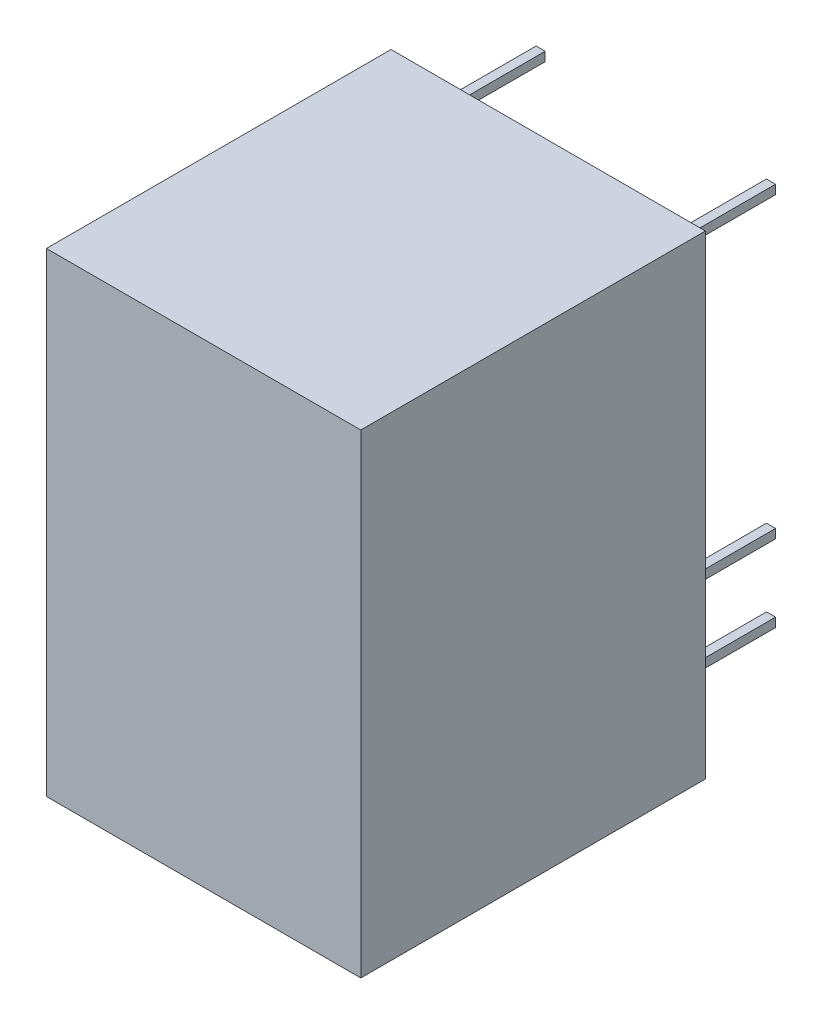
ISO-10303-21;
HEADER;
FILE_DESCRIPTION(('STEP AP214'),'2;1');
FILE_NAME('part.step','',(''),(''),'','','');
FILE_SCHEMA(('AUTOMOTIVE_DESIGN { 1 0 10303 214 1 1 1 1 }'));
ENDSEC;
DATA;
#1=APPLICATION_CONTEXT('core data for automotive mechanical design processes');
#2=APPLICATION_PROTOCOL_DEFINITION('international standard','automotive_design',2000,#1);
#3=PRODUCT_CONTEXT('',#1,'mechanical');
#4=PRODUCT('Part','Part','',(#3));
#5=PRODUCT_RELATED_PRODUCT_CATEGORY('part','',(#4));
#6=PRODUCT_DEFINITION_FORMATION('','',#4);
#7=PRODUCT_DEFINITION_CONTEXT('part definition',#1,'design');
#8=PRODUCT_DEFINITION('design','',#6,#7);
#9=PRODUCT_DEFINITION_SHAPE('','',#8);
#10=(LENGTH_UNIT() NAMED_UNIT(*) SI_UNIT(.MILLI.,.METRE.));
#11=(NAMED_UNIT(*) PLANE_ANGLE_UNIT() SI_UNIT($,.RADIAN.));
#12=(NAMED_UNIT(*) SI_UNIT($,.STERADIAN.) SOLID_ANGLE_UNIT());
#13=UNCERTAINTY_MEASURE_WITH_UNIT(LENGTH_MEASURE(1.E-05),#10,'distance_accuracy_value','');
#14=(GEOMETRIC_REPRESENTATION_CONTEXT(3) GLOBAL_UNCERTAINTY_ASSIGNED_CONTEXT((#13)) GLOBAL_UNIT_ASSIGNED_CONTEXT((#10,
#11,#12)) REPRESENTATION_CONTEXT('',''));
#15=CARTESIAN_POINT('',(0.,0.,0.));
#16=DIRECTION('',(0.,0.,1.));
#17=DIRECTION('',(1.,0.,0.));
#18=AXIS2_PLACEMENT_3D('',#15,#16,#17);
#19=CARTESIAN_POINT('',(0.15,-10.01,0.));
#20=DIRECTION('',(1.,0.,0.));
#21=DIRECTION('',(0.,1.,0.));
#22=AXIS2_PLACEMENT_3D('',#19,#20,#21);
#23=PLANE('',#22);
#24=DIRECTION('',(0.,0.,1.));
#25=VECTOR('',#24,1.);
#26=CARTESIAN_POINT('',(0.15,-9.71,0.));
#27=LINE('',#26,#25);
#28=CARTESIAN_POINT('',(0.15,-9.71,0.));
#29=VERTEX_POINT('',#28);
#30=CARTESIAN_POINT('',(0.15,-9.71,-3.6));
#31=VERTEX_POINT('',#30);
#32=EDGE_CURVE('E199',#29,#31,#27,.F.);
#33=ORIENTED_EDGE('',*,*,#32,.F.);
#34=DIRECTION('',(0.,1.,0.));
#35=VECTOR('',#34,1.);
#36=CARTESIAN_POINT('',(0.15,-10.01,0.));
#37=LINE('',#36,#35);
#38=CARTESIAN_POINT('',(0.15,-10.01,0.));
#39=VERTEX_POINT('',#38);
#40=EDGE_CURVE('E20',#29,#39,#37,.F.);
#41=ORIENTED_EDGE('',*,*,#40,.T.);
#42=DIRECTION('',(0.,0.,1.));
#43=VECTOR('',#42,1.);
#44=CARTESIAN_POINT('',(0.15,-10.01,0.));
#45=LINE('',#44,#43);
#46=CARTESIAN_POINT('',(0.15,-10.01,-3.6));
#47=VERTEX_POINT('',#46);
#48=EDGE_CURVE('E270',#47,#39,#45,.T.);
#49=ORIENTED_EDGE('',*,*,#48,.F.);
#50=DIRECTION('',(0.,1.,0.));
#51=VECTOR('',#50,1.);
#52=CARTESIAN_POINT('',(0.15,-10.01,-3.6));
#53=LINE('',#52,#51);
#54=EDGE_CURVE('E219',#31,#47,#53,.F.);
#55=ORIENTED_EDGE('',*,*,#54,.F.);
#56=EDGE_LOOP('',(#33,#41,#49,#55));
#57=FACE_BOUND('',#56,.T.);
#58=ADVANCED_FACE('F17',(#57),#23,.T.);
#59=CARTESIAN_POINT('',(-0.15,0.15,0.));
#60=DIRECTION('',(-1.,0.,0.));
#61=DIRECTION('',(0.,-1.,0.));
#62=AXIS2_PLACEMENT_3D('',#59,#60,#61);
#63=PLANE('',#62);
#64=DIRECTION('',(0.,0.,1.));
#65=VECTOR('',#64,1.);
#66=CARTESIAN_POINT('',(-0.15,-0.15,0.));
#67=LINE('',#66,#65);
#68=CARTESIAN_POINT('',(-0.15,-0.15,0.));
#69=VERTEX_POINT('',#68);
#70=CARTESIAN_POINT('',(-0.15,-0.15,-3.6));
#71=VERTEX_POINT('',#70);
#72=EDGE_CURVE('E237',#69,#71,#67,.F.);
#73=ORIENTED_EDGE('',*,*,#72,.F.);
#74=DIRECTION('',(0.,-1.,0.));
#75=VECTOR('',#74,1.);
#76=CARTESIAN_POINT('',(-0.15,0.15,0.));
#77=LINE('',#76,#75);
#78=CARTESIAN_POINT('',(-0.15,0.15,0.));
#79=VERTEX_POINT('',#78);
#80=EDGE_CURVE('E212',#69,#79,#77,.F.);
#81=ORIENTED_EDGE('',*,*,#80,.T.);
#82=DIRECTION('',(0.,0.,1.));
#83=VECTOR('',#82,1.);
#84=CARTESIAN_POINT('',(-0.15,0.15,0.));
#85=LINE('',#84,#83);
#86=CARTESIAN_POINT('',(-0.15,0.15,-3.6));
#87=VERTEX_POINT('',#86);
#88=EDGE_CURVE('E236',#87,#79,#85,.T.);
#89=ORIENTED_EDGE('',*,*,#88,.F.);
#90=DIRECTION('',(0.,1.,0.));
#91=VECTOR('',#90,1.);
#92=CARTESIAN_POINT('',(-0.15,0.15,-3.6));
#93=LINE('',#92,#91);
#94=EDGE_CURVE('E261',#71,#87,#93,.T.);
#95=ORIENTED_EDGE('',*,*,#94,.F.);
#96=EDGE_LOOP('',(#73,#81,#89,#95));
#97=FACE_BOUND('',#96,.T.);
#98=ADVANCED_FACE('F234',(#97),#63,.T.);
#99=CARTESIAN_POINT('',(7.77,-10.01,0.));
#100=DIRECTION('',(0.,1.,0.));
#101=DIRECTION('',(-1.,0.,0.));
#102=AXIS2_PLACEMENT_3D('',#99,#100,#101);
#103=PLANE('',#102);
#104=DIRECTION('',(0.,0.,1.));
#105=VECTOR('',#104,1.);
#106=CARTESIAN_POINT('',(7.47,-10.01,0.));
#107=LINE('',#106,#105);
#108=CARTESIAN_POINT('',(7.47,-10.01,0.));
#109=VERTEX_POINT('',#108);
#110=CARTESIAN_POINT('',(7.47,-10.01,-3.6));
#111=VERTEX_POINT('',#110);
#112=EDGE_CURVE('E253',#109,#111,#107,.F.);
#113=ORIENTED_EDGE('',*,*,#112,.T.);
#114=DIRECTION('',(1.,0.,0.));
#115=VECTOR('',#114,1.);
#116=CARTESIAN_POINT('',(7.47,-10.01,-3.6));
#117=LINE('',#116,#115);
#118=CARTESIAN_POINT('',(7.77,-10.01,-3.6));
#119=VERTEX_POINT('',#118);
#120=EDGE_CURVE('E357',#111,#119,#117,.T.);
#121=ORIENTED_EDGE('',*,*,#120,.T.);
#122=DIRECTION('',(0.,0.,1.));
#123=VECTOR('',#122,1.);
#124=CARTESIAN_POINT('',(7.77,-10.01,0.));
#125=LINE('',#124,#123);
#126=CARTESIAN_POINT('',(7.77,-10.01,0.));
#127=VERTEX_POINT('',#126);
#128=EDGE_CURVE('E348',#119,#127,#125,.T.);
#129=ORIENTED_EDGE('',*,*,#128,.T.);
#130=DIRECTION('',(-1.,0.,0.));
#131=VECTOR('',#130,1.);
#132=CARTESIAN_POINT('',(7.77,-10.01,0.));
#133=LINE('',#132,#131);
#134=EDGE_CURVE('E229',#109,#127,#133,.F.);
#135=ORIENTED_EDGE('',*,*,#134,.F.);
#136=EDGE_LOOP('',(#113,#121,#129,#135));
#137=FACE_BOUND('',#136,.T.);
#138=ADVANCED_FACE('F744',(#137),#103,.F.);
#139=CARTESIAN_POINT('',(7.47,0.15,0.));
#140=DIRECTION('',(0.,-1.,0.));
#141=DIRECTION('',(1.,0.,0.));
#142=AXIS2_PLACEMENT_3D('',#139,#140,#141);
#143=PLANE('',#142);
#144=DIRECTION('',(0.,0.,1.));
#145=VECTOR('',#144,1.);
#146=CARTESIAN_POINT('',(7.77,0.15,0.));
#147=LINE('',#146,#145);
#148=CARTESIAN_POINT('',(7.77,0.15,0.));
#149=VERTEX_POINT('',#148);
#150=CARTESIAN_POINT('',(7.77,0.15,-3.6));
#151=VERTEX_POINT('',#150);
#152=EDGE_CURVE('E343',#149,#151,#147,.F.);
#153=ORIENTED_EDGE('',*,*,#152,.T.);
#154=DIRECTION('',(1.,0.,0.));
#155=VECTOR('',#154,1.);
#156=CARTESIAN_POINT('',(7.77,0.15,-3.6));
#157=LINE('',#156,#155);
#158=CARTESIAN_POINT('',(7.47,0.15,-3.6));
#159=VERTEX_POINT('',#158);
#160=EDGE_CURVE('E338',#151,#159,#157,.F.);
#161=ORIENTED_EDGE('',*,*,#160,.T.);
#162=DIRECTION('',(0.,0.,1.));
#163=VECTOR('',#162,1.);
#164=CARTESIAN_POINT('',(7.47,0.15,0.));
#165=LINE('',#164,#163);
#166=CARTESIAN_POINT('',(7.47,0.15,0.));
#167=VERTEX_POINT('',#166);
#168=EDGE_CURVE('E329',#159,#167,#165,.T.);
#169=ORIENTED_EDGE('',*,*,#168,.T.);
#170=DIRECTION('',(1.,0.,0.));
#171=VECTOR('',#170,1.);
#172=CARTESIAN_POINT('',(7.47,0.15,0.));
#173=LINE('',#172,#171);
#174=EDGE_CURVE('E227',#149,#167,#173,.F.);
#175=ORIENTED_EDGE('',*,*,#174,.F.);
#176=EDGE_LOOP('',(#153,#161,#169,#175));
#177=FACE_BOUND('',#176,.T.);
#178=ADVANCED_FACE('F735',(#177),#143,.F.);
#179=CARTESIAN_POINT('',(7.771869,-12.55,0.));
#180=DIRECTION('',(0.,1.,0.));
#181=DIRECTION('',(-1.,0.,0.));
#182=AXIS2_PLACEMENT_3D('',#179,#180,#181);
#183=PLANE('',#182);
#184=DIRECTION('',(0.,0.,1.));
#185=VECTOR('',#184,1.);
#186=CARTESIAN_POINT('',(7.471869,-12.55,0.));
#187=LINE('',#186,#185);
#188=CARTESIAN_POINT('',(7.471869,-12.55,0.));
#189=VERTEX_POINT('',#188);
#190=CARTESIAN_POINT('',(7.471869,-12.55,-3.6));
#191=VERTEX_POINT('',#190);
#192=EDGE_CURVE('E324',#189,#191,#187,.F.);
#193=ORIENTED_EDGE('',*,*,#192,.T.);
#194=DIRECTION('',(1.,0.,0.));
#195=VECTOR('',#194,1.);
#196=CARTESIAN_POINT('',(7.471869,-12.55,-3.6));
#197=LINE('',#196,#195);
#198=CARTESIAN_POINT('',(7.771869,-12.55,-3.6));
#199=VERTEX_POINT('',#198);
#200=EDGE_CURVE('E319',#191,#199,#197,.T.);
#201=ORIENTED_EDGE('',*,*,#200,.T.);
#202=DIRECTION('',(0.,0.,1.));
#203=VECTOR('',#202,1.);
#204=CARTESIAN_POINT('',(7.771869,-12.55,0.));
#205=LINE('',#204,#203);
#206=CARTESIAN_POINT('',(7.771869,-12.55,0.));
#207=VERTEX_POINT('',#206);
#208=EDGE_CURVE('E310',#199,#207,#205,.T.);
#209=ORIENTED_EDGE('',*,*,#208,.T.);
#210=DIRECTION('',(-1.,0.,0.));
#211=VECTOR('',#210,1.);
#212=CARTESIAN_POINT('',(7.771869,-12.55,0.));
#213=LINE('',#212,#211);
#214=EDGE_CURVE('E222',#189,#207,#213,.F.);
#215=ORIENTED_EDGE('',*,*,#214,.F.);
#216=EDGE_LOOP('',(#193,#201,#209,#215));
#217=FACE_BOUND('',#216,.T.);
#218=ADVANCED_FACE('F726',(#217),#183,.F.);
#219=CARTESIAN_POINT('',(0.151869,-12.55,0.));
#220=DIRECTION('',(1.,0.,0.));
#221=DIRECTION('',(0.,1.,0.));
#222=AXIS2_PLACEMENT_3D('',#219,#220,#221);
#223=PLANE('',#222);
#224=DIRECTION('',(0.,0.,1.));
#225=VECTOR('',#224,1.);
#226=CARTESIAN_POINT('',(0.151869,-12.25,0.));
#227=LINE('',#226,#225);
#228=CARTESIAN_POINT('',(0.151869,-12.25,0.));
#229=VERTEX_POINT('',#228);
#230=CARTESIAN_POINT('',(0.151869,-12.25,-3.6));
#231=VERTEX_POINT('',#230);
#232=EDGE_CURVE('E306',#229,#231,#227,.F.);
#233=ORIENTED_EDGE('',*,*,#232,.F.);
#234=DIRECTION('',(0.,1.,0.));
#235=VECTOR('',#234,1.);
#236=CARTESIAN_POINT('',(0.151869,-12.55,0.));
#237=LINE('',#236,#235);
#238=CARTESIAN_POINT('',(0.151869,-12.55,0.));
#239=VERTEX_POINT('',#238);
#240=EDGE_CURVE('E220',#229,#239,#237,.F.);
#241=ORIENTED_EDGE('',*,*,#240,.T.);
#242=DIRECTION('',(0.,0.,1.));
#243=VECTOR('',#242,1.);
#244=CARTESIAN_POINT('',(0.151869,-12.55,0.));
#245=LINE('',#244,#243);
#246=CARTESIAN_POINT('',(0.151869,-12.55,-3.6));
#247=VERTEX_POINT('',#246);
#248=EDGE_CURVE('E292',#247,#239,#245,.T.);
#249=ORIENTED_EDGE('',*,*,#248,.F.);
#250=DIRECTION('',(0.,1.,0.));
#251=VECTOR('',#250,1.);
#252=CARTESIAN_POINT('',(0.151869,-12.55,-3.6));
#253=LINE('',#252,#251);
#254=EDGE_CURVE('E298',#231,#247,#253,.F.);
#255=ORIENTED_EDGE('',*,*,#254,.F.);
#256=EDGE_LOOP('',(#233,#241,#249,#255));
#257=FACE_BOUND('',#256,.T.);
#258=ADVANCED_FACE('F718',(#257),#223,.T.);
#259=CARTESIAN_POINT('',(0.15,-9.71,0.));
#260=DIRECTION('',(0.,1.,0.));
#261=DIRECTION('',(-1.,0.,0.));
#262=AXIS2_PLACEMENT_3D('',#259,#260,#261);
#263=PLANE('',#262);
#264=DIRECTION('',(0.,0.,1.));
#265=VECTOR('',#264,1.);
#266=CARTESIAN_POINT('',(-0.15,-9.71,0.));
#267=LINE('',#266,#265);
#268=CARTESIAN_POINT('',(-0.15,-9.71,0.));
#269=VERTEX_POINT('',#268);
#270=CARTESIAN_POINT('',(-0.15,-9.71,-3.6));
#271=VERTEX_POINT('',#270);
#272=EDGE_CURVE('E214',#269,#271,#267,.F.);
#273=ORIENTED_EDGE('',*,*,#272,.F.);
#274=DIRECTION('',(-1.,0.,0.));
#275=VECTOR('',#274,1.);
#276=CARTESIAN_POINT('',(0.15,-9.71,0.));
#277=LINE('',#276,#275);
#278=EDGE_CURVE('E206',#269,#29,#277,.F.);
#279=ORIENTED_EDGE('',*,*,#278,.T.);
#280=ORIENTED_EDGE('',*,*,#32,.T.);
#281=DIRECTION('',(-1.,0.,0.));
#282=VECTOR('',#281,1.);
#283=CARTESIAN_POINT('',(0.15,-9.71,-3.6));
#284=LINE('',#283,#282);
#285=EDGE_CURVE('E216',#271,#31,#284,.F.);
#286=ORIENTED_EDGE('',*,*,#285,.F.);
#287=EDGE_LOOP('',(#273,#279,#280,#286));
#288=FACE_BOUND('',#287,.T.);
#289=ADVANCED_FACE('F213',(#288),#263,.T.);
#290=CARTESIAN_POINT('',(0.15,-10.01,-3.6));
#291=DIRECTION('',(0.,0.,-1.));
#292=DIRECTION('',(-1.,0.,0.));
#293=AXIS2_PLACEMENT_3D('',#290,#291,#292);
#294=PLANE('',#293);
#295=ORIENTED_EDGE('',*,*,#285,.T.);
#296=ORIENTED_EDGE('',*,*,#54,.T.);
#297=DIRECTION('',(1.,0.,0.));
#298=VECTOR('',#297,1.);
#299=CARTESIAN_POINT('',(-0.15,-10.01,-3.6));
#300=LINE('',#299,#298);
#301=CARTESIAN_POINT('',(-0.15,-10.01,-3.6));
#302=VERTEX_POINT('',#301);
#303=EDGE_CURVE('E272',#302,#47,#300,.T.);
#304=ORIENTED_EDGE('',*,*,#303,.F.);
#305=DIRECTION('',(0.,-1.,0.));
#306=VECTOR('',#305,1.);
#307=CARTESIAN_POINT('',(-0.15,-9.71,-3.6));
#308=LINE('',#307,#306);
#309=EDGE_CURVE('E279',#271,#302,#308,.T.);
#310=ORIENTED_EDGE('',*,*,#309,.F.);
#311=EDGE_LOOP('',(#295,#296,#304,#310));
#312=FACE_BOUND('',#311,.T.);
#313=ADVANCED_FACE('F277',(#312),#294,.T.);
#314=CARTESIAN_POINT('',(-0.15,-10.01,0.));
#315=DIRECTION('',(0.,-1.,0.));
#316=DIRECTION('',(1.,0.,0.));
#317=AXIS2_PLACEMENT_3D('',#314,#315,#316);
#318=PLANE('',#317);
#319=ORIENTED_EDGE('',*,*,#48,.T.);
#320=DIRECTION('',(1.,0.,0.));
#321=VECTOR('',#320,1.);
#322=CARTESIAN_POINT('',(-0.15,-10.01,0.));
#323=LINE('',#322,#321);
#324=CARTESIAN_POINT('',(-0.15,-10.01,0.));
#325=VERTEX_POINT('',#324);
#326=EDGE_CURVE('E208',#39,#325,#323,.F.);
#327=ORIENTED_EDGE('',*,*,#326,.T.);
#328=DIRECTION('',(0.,0.,1.));
#329=VECTOR('',#328,1.);
#330=CARTESIAN_POINT('',(-0.15,-10.01,0.));
#331=LINE('',#330,#329);
#332=EDGE_CURVE('E283',#302,#325,#331,.T.);
#333=ORIENTED_EDGE('',*,*,#332,.F.);
#334=ORIENTED_EDGE('',*,*,#303,.T.);
#335=EDGE_LOOP('',(#319,#327,#333,#334));
#336=FACE_BOUND('',#335,.T.);
#337=ADVANCED_FACE('F401',(#336),#318,.T.);
#338=CARTESIAN_POINT('',(-0.15,-0.15,0.));
#339=DIRECTION('',(0.,-1.,0.));
#340=DIRECTION('',(1.,0.,0.));
#341=AXIS2_PLACEMENT_3D('',#338,#339,#340);
#342=PLANE('',#341);
#343=DIRECTION('',(0.,0.,1.));
#344=VECTOR('',#343,1.);
#345=CARTESIAN_POINT('',(0.15,-0.15,0.));
#346=LINE('',#345,#344);
#347=CARTESIAN_POINT('',(0.15,-0.15,0.));
#348=VERTEX_POINT('',#347);
#349=CARTESIAN_POINT('',(0.15,-0.15,-3.6));
#350=VERTEX_POINT('',#349);
#351=EDGE_CURVE('E285',#348,#350,#346,.F.);
#352=ORIENTED_EDGE('',*,*,#351,.F.);
#353=DIRECTION('',(1.,0.,0.));
#354=VECTOR('',#353,1.);
#355=CARTESIAN_POINT('',(-0.15,-0.15,0.));
#356=LINE('',#355,#354);
#357=EDGE_CURVE('E266',#348,#69,#356,.F.);
#358=ORIENTED_EDGE('',*,*,#357,.T.);
#359=ORIENTED_EDGE('',*,*,#72,.T.);
#360=DIRECTION('',(-1.,0.,0.));
#361=VECTOR('',#360,1.);
#362=CARTESIAN_POINT('',(-0.15,-0.15,-3.6));
#363=LINE('',#362,#361);
#364=EDGE_CURVE('E263',#350,#71,#363,.T.);
#365=ORIENTED_EDGE('',*,*,#364,.F.);
#366=EDGE_LOOP('',(#352,#358,#359,#365));
#367=FACE_BOUND('',#366,.T.);
#368=ADVANCED_FACE('F390',(#367),#342,.T.);
#369=CARTESIAN_POINT('',(-0.15,0.15,-3.6));
#370=DIRECTION('',(0.,0.,-1.));
#371=DIRECTION('',(-1.,0.,0.));
#372=AXIS2_PLACEMENT_3D('',#369,#370,#371);
#373=PLANE('',#372);
#374=ORIENTED_EDGE('',*,*,#364,.T.);
#375=ORIENTED_EDGE('',*,*,#94,.T.);
#376=DIRECTION('',(-1.,0.,0.));
#377=VECTOR('',#376,1.);
#378=CARTESIAN_POINT('',(0.15,0.15,-3.6));
#379=LINE('',#378,#377);
#380=CARTESIAN_POINT('',(0.15,0.15,-3.6));
#381=VERTEX_POINT('',#380);
#382=EDGE_CURVE('E248',#381,#87,#379,.T.);
#383=ORIENTED_EDGE('',*,*,#382,.F.);
#384=DIRECTION('',(0.,1.,0.));
#385=VECTOR('',#384,1.);
#386=CARTESIAN_POINT('',(0.15,-0.15,-3.6));
#387=LINE('',#386,#385);
#388=EDGE_CURVE('E380',#350,#381,#387,.T.);
#389=ORIENTED_EDGE('',*,*,#388,.F.);
#390=EDGE_LOOP('',(#374,#375,#383,#389));
#391=FACE_BOUND('',#390,.T.);
#392=ADVANCED_FACE('F392',(#391),#373,.T.);
#393=CARTESIAN_POINT('',(0.15,0.15,0.));
#394=DIRECTION('',(0.,1.,0.));
#395=DIRECTION('',(-1.,0.,0.));
#396=AXIS2_PLACEMENT_3D('',#393,#394,#395);
#397=PLANE('',#396);
#398=ORIENTED_EDGE('',*,*,#88,.T.);
#399=DIRECTION('',(-1.,0.,0.));
#400=VECTOR('',#399,1.);
#401=CARTESIAN_POINT('',(0.15,0.15,0.));
#402=LINE('',#401,#400);
#403=CARTESIAN_POINT('',(0.15,0.15,0.));
#404=VERTEX_POINT('',#403);
#405=EDGE_CURVE('E245',#79,#404,#402,.F.);
#406=ORIENTED_EDGE('',*,*,#405,.T.);
#407=DIRECTION('',(0.,0.,1.));
#408=VECTOR('',#407,1.);
#409=CARTESIAN_POINT('',(0.15,0.15,0.));
#410=LINE('',#409,#408);
#411=EDGE_CURVE('E376',#381,#404,#410,.T.);
#412=ORIENTED_EDGE('',*,*,#411,.F.);
#413=ORIENTED_EDGE('',*,*,#382,.T.);
#414=EDGE_LOOP('',(#398,#406,#412,#413));
#415=FACE_BOUND('',#414,.T.);
#416=ADVANCED_FACE('F243',(#415),#397,.T.);
#417=CARTESIAN_POINT('',(7.47,-10.01,0.));
#418=DIRECTION('',(1.,0.,0.));
#419=DIRECTION('',(0.,1.,0.));
#420=AXIS2_PLACEMENT_3D('',#417,#418,#419);
#421=PLANE('',#420);
#422=DIRECTION('',(0.,0.,1.));
#423=VECTOR('',#422,1.);
#424=CARTESIAN_POINT('',(7.47,-9.71,0.));
#425=LINE('',#424,#423);
#426=CARTESIAN_POINT('',(7.47,-9.71,0.));
#427=VERTEX_POINT('',#426);
#428=CARTESIAN_POINT('',(7.47,-9.71,-3.6));
#429=VERTEX_POINT('',#428);
#430=EDGE_CURVE('E369',#427,#429,#425,.F.);
#431=ORIENTED_EDGE('',*,*,#430,.T.);
#432=DIRECTION('',(0.,1.,0.));
#433=VECTOR('',#432,1.);
#434=CARTESIAN_POINT('',(7.47,-10.01,-3.6));
#435=LINE('',#434,#433);
#436=EDGE_CURVE('E354',#429,#111,#435,.F.);
#437=ORIENTED_EDGE('',*,*,#436,.T.);
#438=ORIENTED_EDGE('',*,*,#112,.F.);
#439=DIRECTION('',(0.,1.,0.));
#440=VECTOR('',#439,1.);
#441=CARTESIAN_POINT('',(7.47,-10.01,0.));
#442=LINE('',#441,#440);
#443=EDGE_CURVE('E256',#427,#109,#442,.F.);
#444=ORIENTED_EDGE('',*,*,#443,.F.);
#445=EDGE_LOOP('',(#431,#437,#438,#444));
#446=FACE_BOUND('',#445,.T.);
#447=ADVANCED_FACE('F368',(#446),#421,.F.);
#448=CARTESIAN_POINT('',(7.47,-10.01,-3.6));
#449=DIRECTION('',(0.,0.,1.));
#450=DIRECTION('',(1.,0.,0.));
#451=AXIS2_PLACEMENT_3D('',#448,#449,#450);
#452=PLANE('',#451);
#453=DIRECTION('',(1.,0.,0.));
#454=VECTOR('',#453,1.);
#455=CARTESIAN_POINT('',(7.47,-9.71,-3.6));
#456=LINE('',#455,#454);
#457=CARTESIAN_POINT('',(7.77,-9.71,-3.6));
#458=VERTEX_POINT('',#457);
#459=EDGE_CURVE('E375',#429,#458,#456,.T.);
#460=ORIENTED_EDGE('',*,*,#459,.T.);
#461=DIRECTION('',(0.,-1.,0.));
#462=VECTOR('',#461,1.);
#463=CARTESIAN_POINT('',(7.77,-9.71,-3.6));
#464=LINE('',#463,#462);
#465=EDGE_CURVE('E351',#458,#119,#464,.T.);
#466=ORIENTED_EDGE('',*,*,#465,.T.);
#467=ORIENTED_EDGE('',*,*,#120,.F.);
#468=ORIENTED_EDGE('',*,*,#436,.F.);
#469=EDGE_LOOP('',(#460,#466,#467,#468));
#470=FACE_BOUND('',#469,.T.);
#471=ADVANCED_FACE('F488',(#470),#452,.F.);
#472=CARTESIAN_POINT('',(7.77,-9.71,0.));
#473=DIRECTION('',(-1.,0.,0.));
#474=DIRECTION('',(0.,-1.,0.));
#475=AXIS2_PLACEMENT_3D('',#472,#473,#474);
#476=PLANE('',#475);
#477=ORIENTED_EDGE('',*,*,#128,.F.);
#478=ORIENTED_EDGE('',*,*,#465,.F.);
#479=DIRECTION('',(0.,0.,1.));
#480=VECTOR('',#479,1.);
#481=CARTESIAN_POINT('',(7.77,-9.71,0.));
#482=LINE('',#481,#480);
#483=CARTESIAN_POINT('',(7.77,-9.71,0.));
#484=VERTEX_POINT('',#483);
#485=EDGE_CURVE('E378',#458,#484,#482,.T.);
#486=ORIENTED_EDGE('',*,*,#485,.T.);
#487=DIRECTION('',(0.,-1.,0.));
#488=VECTOR('',#487,1.);
#489=CARTESIAN_POINT('',(7.77,-9.71,0.));
#490=LINE('',#489,#488);
#491=EDGE_CURVE('E346',#127,#484,#490,.F.);
#492=ORIENTED_EDGE('',*,*,#491,.F.);
#493=EDGE_LOOP('',(#477,#478,#486,#492));
#494=FACE_BOUND('',#493,.T.);
#495=ADVANCED_FACE('F484',(#494),#476,.F.);
#496=CARTESIAN_POINT('',(7.77,0.15,0.));
#497=DIRECTION('',(-1.,0.,0.));
#498=DIRECTION('',(0.,-1.,0.));
#499=AXIS2_PLACEMENT_3D('',#496,#497,#498);
#500=PLANE('',#499);
#501=DIRECTION('',(0.,0.,1.));
#502=VECTOR('',#501,1.);
#503=CARTESIAN_POINT('',(7.77,-0.15,0.));
#504=LINE('',#503,#502);
#505=CARTESIAN_POINT('',(7.77,-0.15,0.));
#506=VERTEX_POINT('',#505);
#507=CARTESIAN_POINT('',(7.77,-0.15,-3.6));
#508=VERTEX_POINT('',#507);
#509=EDGE_CURVE('E779',#506,#508,#504,.F.);
#510=ORIENTED_EDGE('',*,*,#509,.T.);
#511=DIRECTION('',(0.,1.,0.));
#512=VECTOR('',#511,1.);
#513=CARTESIAN_POINT('',(7.77,0.15,-3.6));
#514=LINE('',#513,#512);
#515=EDGE_CURVE('E335',#508,#151,#514,.T.);
#516=ORIENTED_EDGE('',*,*,#515,.T.);
#517=ORIENTED_EDGE('',*,*,#152,.F.);
#518=DIRECTION('',(0.,-1.,0.));
#519=VECTOR('',#518,1.);
#520=CARTESIAN_POINT('',(7.77,0.15,0.));
#521=LINE('',#520,#519);
#522=EDGE_CURVE('E340',#506,#149,#521,.F.);
#523=ORIENTED_EDGE('',*,*,#522,.F.);
#524=EDGE_LOOP('',(#510,#516,#517,#523));
#525=FACE_BOUND('',#524,.T.);
#526=ADVANCED_FACE('F480',(#525),#500,.F.);
#527=CARTESIAN_POINT('',(7.77,0.15,-3.6));
#528=DIRECTION('',(0.,0.,1.));
#529=DIRECTION('',(1.,0.,0.));
#530=AXIS2_PLACEMENT_3D('',#527,#528,#529);
#531=PLANE('',#530);
#532=DIRECTION('',(-1.,0.,0.));
#533=VECTOR('',#532,1.);
#534=CARTESIAN_POINT('',(7.77,-0.15,-3.6));
#535=LINE('',#534,#533);
#536=CARTESIAN_POINT('',(7.47,-0.15,-3.6));
#537=VERTEX_POINT('',#536);
#538=EDGE_CURVE('E781',#508,#537,#535,.T.);
#539=ORIENTED_EDGE('',*,*,#538,.T.);
#540=DIRECTION('',(0.,1.,0.));
#541=VECTOR('',#540,1.);
#542=CARTESIAN_POINT('',(7.47,-0.15,-3.6));
#543=LINE('',#542,#541);
#544=EDGE_CURVE('E332',#537,#159,#543,.T.);
#545=ORIENTED_EDGE('',*,*,#544,.T.);
#546=ORIENTED_EDGE('',*,*,#160,.F.);
#547=ORIENTED_EDGE('',*,*,#515,.F.);
#548=EDGE_LOOP('',(#539,#545,#546,#547));
#549=FACE_BOUND('',#548,.T.);
#550=ADVANCED_FACE('F476',(#549),#531,.F.);
#551=CARTESIAN_POINT('',(7.47,-0.15,0.));
#552=DIRECTION('',(1.,0.,0.));
#553=DIRECTION('',(0.,1.,0.));
#554=AXIS2_PLACEMENT_3D('',#551,#552,#553);
#555=PLANE('',#554);
#556=ORIENTED_EDGE('',*,*,#168,.F.);
#557=ORIENTED_EDGE('',*,*,#544,.F.);
#558=DIRECTION('',(0.,0.,1.));
#559=VECTOR('',#558,1.);
#560=CARTESIAN_POINT('',(7.47,-0.15,0.));
#561=LINE('',#560,#559);
#562=CARTESIAN_POINT('',(7.47,-0.15,0.));
#563=VERTEX_POINT('',#562);
#564=EDGE_CURVE('E786',#537,#563,#561,.T.);
#565=ORIENTED_EDGE('',*,*,#564,.T.);
#566=DIRECTION('',(0.,1.,0.));
#567=VECTOR('',#566,1.);
#568=CARTESIAN_POINT('',(7.47,-0.15,0.));
#569=LINE('',#568,#567);
#570=EDGE_CURVE('E327',#167,#563,#569,.F.);
#571=ORIENTED_EDGE('',*,*,#570,.F.);
#572=EDGE_LOOP('',(#556,#557,#565,#571));
#573=FACE_BOUND('',#572,.T.);
#574=ADVANCED_FACE('F472',(#573),#555,.F.);
#575=CARTESIAN_POINT('',(7.471869,-12.55,0.));
#576=DIRECTION('',(1.,0.,0.));
#577=DIRECTION('',(0.,1.,0.));
#578=AXIS2_PLACEMENT_3D('',#575,#576,#577);
#579=PLANE('',#578);
#580=DIRECTION('',(0.,0.,1.));
#581=VECTOR('',#580,1.);
#582=CARTESIAN_POINT('',(7.471869,-12.25,0.));
#583=LINE('',#582,#581);
#584=CARTESIAN_POINT('',(7.471869,-12.25,0.));
#585=VERTEX_POINT('',#584);
#586=CARTESIAN_POINT('',(7.471869,-12.25,-3.6));
#587=VERTEX_POINT('',#586);
#588=EDGE_CURVE('E789',#585,#587,#583,.F.);
#589=ORIENTED_EDGE('',*,*,#588,.T.);
#590=DIRECTION('',(0.,1.,0.));
#591=VECTOR('',#590,1.);
#592=CARTESIAN_POINT('',(7.471869,-12.55,-3.6));
#593=LINE('',#592,#591);
#594=EDGE_CURVE('E316',#587,#191,#593,.F.);
#595=ORIENTED_EDGE('',*,*,#594,.T.);
#596=ORIENTED_EDGE('',*,*,#192,.F.);
#597=DIRECTION('',(0.,1.,0.));
#598=VECTOR('',#597,1.);
#599=CARTESIAN_POINT('',(7.471869,-12.55,0.));
#600=LINE('',#599,#598);
#601=EDGE_CURVE('E321',#585,#189,#600,.F.);
#602=ORIENTED_EDGE('',*,*,#601,.F.);
#603=EDGE_LOOP('',(#589,#595,#596,#602));
#604=FACE_BOUND('',#603,.T.);
#605=ADVANCED_FACE('F468',(#604),#579,.F.);
#606=CARTESIAN_POINT('',(7.471869,-12.55,-3.6));
#607=DIRECTION('',(0.,0.,1.));
#608=DIRECTION('',(1.,0.,0.));
#609=AXIS2_PLACEMENT_3D('',#606,#607,#608);
#610=PLANE('',#609);
#611=DIRECTION('',(1.,0.,0.));
#612=VECTOR('',#611,1.);
#613=CARTESIAN_POINT('',(7.471869,-12.25,-3.6));
#614=LINE('',#613,#612);
#615=CARTESIAN_POINT('',(7.771869,-12.25,-3.6));
#616=VERTEX_POINT('',#615);
#617=EDGE_CURVE('E792',#587,#616,#614,.T.);
#618=ORIENTED_EDGE('',*,*,#617,.T.);
#619=DIRECTION('',(0.,-1.,0.));
#620=VECTOR('',#619,1.);
#621=CARTESIAN_POINT('',(7.771869,-12.25,-3.6));
#622=LINE('',#621,#620);
#623=EDGE_CURVE('E313',#616,#199,#622,.T.);
#624=ORIENTED_EDGE('',*,*,#623,.T.);
#625=ORIENTED_EDGE('',*,*,#200,.F.);
#626=ORIENTED_EDGE('',*,*,#594,.F.);
#627=EDGE_LOOP('',(#618,#624,#625,#626));
#628=FACE_BOUND('',#627,.T.);
#629=ADVANCED_FACE('F464',(#628),#610,.F.);
#630=CARTESIAN_POINT('',(7.771869,-12.25,0.));
#631=DIRECTION('',(-1.,0.,0.));
#632=DIRECTION('',(0.,-1.,0.));
#633=AXIS2_PLACEMENT_3D('',#630,#631,#632);
#634=PLANE('',#633);
#635=ORIENTED_EDGE('',*,*,#208,.F.);
#636=ORIENTED_EDGE('',*,*,#623,.F.);
#637=DIRECTION('',(0.,0.,1.));
#638=VECTOR('',#637,1.);
#639=CARTESIAN_POINT('',(7.771869,-12.25,0.));
#640=LINE('',#639,#638);
#641=CARTESIAN_POINT('',(7.771869,-12.25,0.));
#642=VERTEX_POINT('',#641);
#643=EDGE_CURVE('E795',#616,#642,#640,.T.);
#644=ORIENTED_EDGE('',*,*,#643,.T.);
#645=DIRECTION('',(0.,-1.,0.));
#646=VECTOR('',#645,1.);
#647=CARTESIAN_POINT('',(7.771869,-12.25,0.));
#648=LINE('',#647,#646);
#649=EDGE_CURVE('E308',#207,#642,#648,.F.);
#650=ORIENTED_EDGE('',*,*,#649,.F.);
#651=EDGE_LOOP('',(#635,#636,#644,#650));
#652=FACE_BOUND('',#651,.T.);
#653=ADVANCED_FACE('F460',(#652),#634,.F.);
#654=CARTESIAN_POINT('',(0.151869,-12.25,0.));
#655=DIRECTION('',(0.,1.,0.));
#656=DIRECTION('',(-1.,0.,0.));
#657=AXIS2_PLACEMENT_3D('',#654,#655,#656);
#658=PLANE('',#657);
#659=DIRECTION('',(0.,0.,1.));
#660=VECTOR('',#659,1.);
#661=CARTESIAN_POINT('',(-0.148131,-12.25,0.));
#662=LINE('',#661,#660);
#663=CARTESIAN_POINT('',(-0.148131,-12.25,0.));
#664=VERTEX_POINT('',#663);
#665=CARTESIAN_POINT('',(-0.148131,-12.25,-3.6));
#666=VERTEX_POINT('',#665);
#667=EDGE_CURVE('E798',#664,#666,#662,.F.);
#668=ORIENTED_EDGE('',*,*,#667,.F.);
#669=DIRECTION('',(-1.,0.,0.));
#670=VECTOR('',#669,1.);
#671=CARTESIAN_POINT('',(0.151869,-12.25,0.));
#672=LINE('',#671,#670);
#673=EDGE_CURVE('E303',#664,#229,#672,.F.);
#674=ORIENTED_EDGE('',*,*,#673,.T.);
#675=ORIENTED_EDGE('',*,*,#232,.T.);
#676=DIRECTION('',(-1.,0.,0.));
#677=VECTOR('',#676,1.);
#678=CARTESIAN_POINT('',(0.151869,-12.25,-3.6));
#679=LINE('',#678,#677);
#680=EDGE_CURVE('E300',#666,#231,#679,.F.);
#681=ORIENTED_EDGE('',*,*,#680,.F.);
#682=EDGE_LOOP('',(#668,#674,#675,#681));
#683=FACE_BOUND('',#682,.T.);
#684=ADVANCED_FACE('F456',(#683),#658,.T.);
#685=CARTESIAN_POINT('',(0.151869,-12.55,-3.6));
#686=DIRECTION('',(0.,0.,-1.));
#687=DIRECTION('',(-1.,0.,0.));
#688=AXIS2_PLACEMENT_3D('',#685,#686,#687);
#689=PLANE('',#688);
#690=ORIENTED_EDGE('',*,*,#680,.T.);
#691=ORIENTED_EDGE('',*,*,#254,.T.);
#692=DIRECTION('',(1.,0.,0.));
#693=VECTOR('',#692,1.);
#694=CARTESIAN_POINT('',(-0.148131,-12.55,-3.6));
#695=LINE('',#694,#693);
#696=CARTESIAN_POINT('',(-0.148131,-12.55,-3.6));
#697=VERTEX_POINT('',#696);
#698=EDGE_CURVE('E295',#697,#247,#695,.T.);
#699=ORIENTED_EDGE('',*,*,#698,.F.);
#700=DIRECTION('',(0.,-1.,0.));
#701=VECTOR('',#700,1.);
#702=CARTESIAN_POINT('',(-0.148131,-12.25,-3.6));
#703=LINE('',#702,#701);
#704=EDGE_CURVE('E800',#666,#697,#703,.T.);
#705=ORIENTED_EDGE('',*,*,#704,.F.);
#706=EDGE_LOOP('',(#690,#691,#699,#705));
#707=FACE_BOUND('',#706,.T.);
#708=ADVANCED_FACE('F452',(#707),#689,.T.);
#709=CARTESIAN_POINT('',(-0.148131,-12.55,0.));
#710=DIRECTION('',(0.,-1.,0.));
#711=DIRECTION('',(1.,0.,0.));
#712=AXIS2_PLACEMENT_3D('',#709,#710,#711);
#713=PLANE('',#712);
#714=ORIENTED_EDGE('',*,*,#248,.T.);
#715=DIRECTION('',(1.,0.,0.));
#716=VECTOR('',#715,1.);
#717=CARTESIAN_POINT('',(-0.148131,-12.55,0.));
#718=LINE('',#717,#716);
#719=CARTESIAN_POINT('',(-0.148131,-12.55,0.));
#720=VERTEX_POINT('',#719);
#721=EDGE_CURVE('E287',#239,#720,#718,.F.);
#722=ORIENTED_EDGE('',*,*,#721,.T.);
#723=DIRECTION('',(0.,0.,1.));
#724=VECTOR('',#723,1.);
#725=CARTESIAN_POINT('',(-0.148131,-12.55,0.));
#726=LINE('',#725,#724);
#727=EDGE_CURVE('E802',#697,#720,#726,.T.);
#728=ORIENTED_EDGE('',*,*,#727,.F.);
#729=ORIENTED_EDGE('',*,*,#698,.T.);
#730=EDGE_LOOP('',(#714,#722,#728,#729));
#731=FACE_BOUND('',#730,.T.);
#732=ADVANCED_FACE('F448',(#731),#713,.T.);
#733=CARTESIAN_POINT('',(9.05,-14.45,0.));
#734=DIRECTION('',(-1.,0.,0.));
#735=DIRECTION('',(0.,-1.,0.));
#736=AXIS2_PLACEMENT_3D('',#733,#734,#735);
#737=PLANE('',#736);
#738=DIRECTION('',(0.,0.,1.));
#739=VECTOR('',#738,1.);
#740=CARTESIAN_POINT('',(9.05,1.25,0.));
#741=LINE('',#740,#739);
#742=CARTESIAN_POINT('',(9.05,1.25,0.));
#743=VERTEX_POINT('',#742);
#744=CARTESIAN_POINT('',(9.05,1.25,11.4));
#745=VERTEX_POINT('',#744);
#746=EDGE_CURVE('E805',#743,#745,#741,.T.);
#747=ORIENTED_EDGE('',*,*,#746,.T.);
#748=DIRECTION('',(0.,1.,0.));
#749=VECTOR('',#748,1.);
#750=CARTESIAN_POINT('',(9.05,1.25,11.4));
#751=LINE('',#750,#749);
#752=CARTESIAN_POINT('',(9.05,-14.45,11.4));
#753=VERTEX_POINT('',#752);
#754=EDGE_CURVE('E810',#745,#753,#751,.F.);
#755=ORIENTED_EDGE('',*,*,#754,.T.);
#756=DIRECTION('',(0.,0.,1.));
#757=VECTOR('',#756,1.);
#758=CARTESIAN_POINT('',(9.05,-14.45,0.));
#759=LINE('',#758,#757);
#760=CARTESIAN_POINT('',(9.05,-14.45,0.));
#761=VERTEX_POINT('',#760);
#762=EDGE_CURVE('E815',#753,#761,#759,.F.);
#763=ORIENTED_EDGE('',*,*,#762,.T.);
#764=DIRECTION('',(0.,1.,0.));
#765=VECTOR('',#764,1.);
#766=CARTESIAN_POINT('',(9.05,1.25,0.));
#767=LINE('',#766,#765);
#768=EDGE_CURVE('E821',#743,#761,#767,.F.);
#769=ORIENTED_EDGE('',*,*,#768,.F.);
#770=EDGE_LOOP('',(#747,#755,#763,#769));
#771=FACE_BOUND('',#770,.T.);
#772=ADVANCED_FACE('F445',(#771),#737,.F.);
#773=CARTESIAN_POINT('',(-0.15,-9.71,0.));
#774=DIRECTION('',(-1.,0.,0.));
#775=DIRECTION('',(0.,-1.,0.));
#776=AXIS2_PLACEMENT_3D('',#773,#774,#775);
#777=PLANE('',#776);
#778=ORIENTED_EDGE('',*,*,#332,.T.);
#779=DIRECTION('',(0.,1.,0.));
#780=VECTOR('',#779,1.);
#781=CARTESIAN_POINT('',(-0.15,1.25,0.));
#782=LINE('',#781,#780);
#783=EDGE_CURVE('E824',#269,#325,#782,.F.);
#784=ORIENTED_EDGE('',*,*,#783,.F.);
#785=ORIENTED_EDGE('',*,*,#272,.T.);
#786=ORIENTED_EDGE('',*,*,#309,.T.);
#787=EDGE_LOOP('',(#778,#784,#785,#786));
#788=FACE_BOUND('',#787,.T.);
#789=ADVANCED_FACE('F442',(#788),#777,.T.);
#790=CARTESIAN_POINT('',(0.15,-0.15,0.));
#791=DIRECTION('',(1.,0.,0.));
#792=DIRECTION('',(0.,1.,0.));
#793=AXIS2_PLACEMENT_3D('',#790,#791,#792);
#794=PLANE('',#793);
#795=ORIENTED_EDGE('',*,*,#411,.T.);
#796=DIRECTION('',(0.,1.,0.));
#797=VECTOR('',#796,1.);
#798=CARTESIAN_POINT('',(0.15,1.25,0.));
#799=LINE('',#798,#797);
#800=EDGE_CURVE('E252',#348,#404,#799,.T.);
#801=ORIENTED_EDGE('',*,*,#800,.F.);
#802=ORIENTED_EDGE('',*,*,#351,.T.);
#803=ORIENTED_EDGE('',*,*,#388,.T.);
#804=EDGE_LOOP('',(#795,#801,#802,#803));
#805=FACE_BOUND('',#804,.T.);
#806=ADVANCED_FACE('F387',(#805),#794,.T.);
#807=CARTESIAN_POINT('',(7.47,-9.71,0.));
#808=DIRECTION('',(0.,-1.,0.));
#809=DIRECTION('',(1.,0.,0.));
#810=AXIS2_PLACEMENT_3D('',#807,#808,#809);
#811=PLANE('',#810);
#812=ORIENTED_EDGE('',*,*,#485,.F.);
#813=ORIENTED_EDGE('',*,*,#459,.F.);
#814=ORIENTED_EDGE('',*,*,#430,.F.);
#815=DIRECTION('',(-1.,0.,0.));
#816=VECTOR('',#815,1.);
#817=CARTESIAN_POINT('',(-1.35,-9.71,0.));
#818=LINE('',#817,#816);
#819=EDGE_CURVE('E363',#484,#427,#818,.T.);
#820=ORIENTED_EDGE('',*,*,#819,.F.);
#821=EDGE_LOOP('',(#812,#813,#814,#820));
#822=FACE_BOUND('',#821,.T.);
#823=ADVANCED_FACE('F373',(#822),#811,.F.);
#824=CARTESIAN_POINT('',(7.77,-0.15,0.));
#825=DIRECTION('',(0.,1.,0.));
#826=DIRECTION('',(-1.,0.,0.));
#827=AXIS2_PLACEMENT_3D('',#824,#825,#826);
#828=PLANE('',#827);
#829=ORIENTED_EDGE('',*,*,#564,.F.);
#830=ORIENTED_EDGE('',*,*,#538,.F.);
#831=ORIENTED_EDGE('',*,*,#509,.F.);
#832=DIRECTION('',(-1.,0.,0.));
#833=VECTOR('',#832,1.);
#834=CARTESIAN_POINT('',(-1.35,-0.15,0.));
#835=LINE('',#834,#833);
#836=EDGE_CURVE('E828',#563,#506,#835,.F.);
#837=ORIENTED_EDGE('',*,*,#836,.F.);
#838=EDGE_LOOP('',(#829,#830,#831,#837));
#839=FACE_BOUND('',#838,.T.);
#840=ADVANCED_FACE('F433',(#839),#828,.F.);
#841=CARTESIAN_POINT('',(7.471869,-12.25,0.));
#842=DIRECTION('',(0.,-1.,0.));
#843=DIRECTION('',(1.,0.,0.));
#844=AXIS2_PLACEMENT_3D('',#841,#842,#843);
#845=PLANE('',#844);
#846=ORIENTED_EDGE('',*,*,#643,.F.);
#847=ORIENTED_EDGE('',*,*,#617,.F.);
#848=ORIENTED_EDGE('',*,*,#588,.F.);
#849=DIRECTION('',(-1.,0.,0.));
#850=VECTOR('',#849,1.);
#851=CARTESIAN_POINT('',(-1.35,-12.25,0.));
#852=LINE('',#851,#850);
#853=EDGE_CURVE('E831',#642,#585,#852,.T.);
#854=ORIENTED_EDGE('',*,*,#853,.F.);
#855=EDGE_LOOP('',(#846,#847,#848,#854));
#856=FACE_BOUND('',#855,.T.);
#857=ADVANCED_FACE('F429',(#856),#845,.F.);
#858=CARTESIAN_POINT('',(-0.148131,-12.25,0.));
#859=DIRECTION('',(-1.,0.,0.));
#860=DIRECTION('',(0.,-1.,0.));
#861=AXIS2_PLACEMENT_3D('',#858,#859,#860);
#862=PLANE('',#861);
#863=ORIENTED_EDGE('',*,*,#727,.T.);
#864=DIRECTION('',(0.,1.,0.));
#865=VECTOR('',#864,1.);
#866=CARTESIAN_POINT('',(-0.148131,1.25,0.));
#867=LINE('',#866,#865);
#868=EDGE_CURVE('E834',#664,#720,#867,.F.);
#869=ORIENTED_EDGE('',*,*,#868,.F.);
#870=ORIENTED_EDGE('',*,*,#667,.T.);
#871=ORIENTED_EDGE('',*,*,#704,.T.);
#872=EDGE_LOOP('',(#863,#869,#870,#871));
#873=FACE_BOUND('',#872,.T.);
#874=ADVANCED_FACE('F425',(#873),#862,.T.);
#875=CARTESIAN_POINT('',(9.05,1.25,0.));
#876=DIRECTION('',(0.,-1.,0.));
#877=DIRECTION('',(1.,0.,0.));
#878=AXIS2_PLACEMENT_3D('',#875,#876,#877);
#879=PLANE('',#878);
#880=DIRECTION('',(0.,0.,1.));
#881=VECTOR('',#880,1.);
#882=CARTESIAN_POINT('',(-1.35,1.25,0.));
#883=LINE('',#882,#881);
#884=CARTESIAN_POINT('',(-1.35,1.25,0.));
#885=VERTEX_POINT('',#884);
#886=CARTESIAN_POINT('',(-1.35,1.25,11.4));
#887=VERTEX_POINT('',#886);
#888=EDGE_CURVE('E837',#885,#887,#883,.T.);
#889=ORIENTED_EDGE('',*,*,#888,.T.);
#890=DIRECTION('',(-1.,0.,0.));
#891=VECTOR('',#890,1.);
#892=CARTESIAN_POINT('',(-1.35,1.25,11.4));
#893=LINE('',#892,#891);
#894=EDGE_CURVE('E807',#887,#745,#893,.F.);
#895=ORIENTED_EDGE('',*,*,#894,.T.);
#896=ORIENTED_EDGE('',*,*,#746,.F.);
#897=DIRECTION('',(-1.,0.,0.));
#898=VECTOR('',#897,1.);
#899=CARTESIAN_POINT('',(-1.35,1.25,0.));
#900=LINE('',#899,#898);
#901=EDGE_CURVE('E818',#885,#743,#900,.F.);
#902=ORIENTED_EDGE('',*,*,#901,.F.);
#903=EDGE_LOOP('',(#889,#895,#896,#902));
#904=FACE_BOUND('',#903,.T.);
#905=ADVANCED_FACE('F421',(#904),#879,.F.);
#906=CARTESIAN_POINT('',(-1.35,1.25,11.4));
#907=DIRECTION('',(0.,0.,-1.));
#908=DIRECTION('',(-1.,0.,0.));
#909=AXIS2_PLACEMENT_3D('',#906,#907,#908);
#910=PLANE('',#909);
#911=DIRECTION('',(-1.,0.,0.));
#912=VECTOR('',#911,1.);
#913=CARTESIAN_POINT('',(-1.35,-14.45,11.4));
#914=LINE('',#913,#912);
#915=CARTESIAN_POINT('',(-1.35,-14.45,11.4));
#916=VERTEX_POINT('',#915);
#917=EDGE_CURVE('E812',#916,#753,#914,.F.);
#918=ORIENTED_EDGE('',*,*,#917,.T.);
#919=ORIENTED_EDGE('',*,*,#754,.F.);
#920=ORIENTED_EDGE('',*,*,#894,.F.);
#921=DIRECTION('',(0.,1.,0.));
#922=VECTOR('',#921,1.);
#923=CARTESIAN_POINT('',(-1.35,1.25,11.4));
#924=LINE('',#923,#922);
#925=EDGE_CURVE('E840',#887,#916,#924,.F.);
#926=ORIENTED_EDGE('',*,*,#925,.T.);
#927=EDGE_LOOP('',(#918,#919,#920,#926));
#928=FACE_BOUND('',#927,.T.);
#929=ADVANCED_FACE('F417',(#928),#910,.F.);
#930=CARTESIAN_POINT('',(-1.35,-14.45,0.));
#931=DIRECTION('',(0.,1.,0.));
#932=DIRECTION('',(-1.,0.,0.));
#933=AXIS2_PLACEMENT_3D('',#930,#931,#932);
#934=PLANE('',#933);
#935=ORIENTED_EDGE('',*,*,#762,.F.);
#936=ORIENTED_EDGE('',*,*,#917,.F.);
#937=DIRECTION('',(0.,0.,1.));
#938=VECTOR('',#937,1.);
#939=CARTESIAN_POINT('',(-1.35000000000001,-14.45,0.));
#940=LINE('',#939,#938);
#941=CARTESIAN_POINT('',(-1.35,-14.45,0.));
#942=VERTEX_POINT('',#941);
#943=EDGE_CURVE('E26',#916,#942,#940,.F.);
#944=ORIENTED_EDGE('',*,*,#943,.T.);
#945=DIRECTION('',(-1.,0.,0.));
#946=VECTOR('',#945,1.);
#947=CARTESIAN_POINT('',(-1.35,-14.45,0.));
#948=LINE('',#947,#946);
#949=EDGE_CURVE('E34',#761,#942,#948,.T.);
#950=ORIENTED_EDGE('',*,*,#949,.F.);
#951=EDGE_LOOP('',(#935,#936,#944,#950));
#952=FACE_BOUND('',#951,.T.);
#953=ADVANCED_FACE('F410',(#952),#934,.F.);
#954=CARTESIAN_POINT('',(-1.35,1.25,0.));
#955=DIRECTION('',(0.,0.,-1.));
#956=DIRECTION('',(-1.,0.,0.));
#957=AXIS2_PLACEMENT_3D('',#954,#955,#956);
#958=PLANE('',#957);
#959=ORIENTED_EDGE('',*,*,#673,.F.);
#960=ORIENTED_EDGE('',*,*,#868,.T.);
#961=ORIENTED_EDGE('',*,*,#721,.F.);
#962=ORIENTED_EDGE('',*,*,#240,.F.);
#963=EDGE_LOOP('',(#959,#960,#961,#962));
#964=FACE_BOUND('',#963,.T.);
#965=ORIENTED_EDGE('',*,*,#649,.T.);
#966=ORIENTED_EDGE('',*,*,#853,.T.);
#967=ORIENTED_EDGE('',*,*,#601,.T.);
#968=ORIENTED_EDGE('',*,*,#214,.T.);
#969=EDGE_LOOP('',(#965,#966,#967,#968));
#970=FACE_BOUND('',#969,.T.);
#971=ORIENTED_EDGE('',*,*,#570,.T.);
#972=ORIENTED_EDGE('',*,*,#836,.T.);
#973=ORIENTED_EDGE('',*,*,#522,.T.);
#974=ORIENTED_EDGE('',*,*,#174,.T.);
#975=EDGE_LOOP('',(#971,#972,#973,#974));
#976=FACE_BOUND('',#975,.T.);
#977=ORIENTED_EDGE('',*,*,#491,.T.);
#978=ORIENTED_EDGE('',*,*,#819,.T.);
#979=ORIENTED_EDGE('',*,*,#443,.T.);
#980=ORIENTED_EDGE('',*,*,#134,.T.);
#981=EDGE_LOOP('',(#977,#978,#979,#980));
#982=FACE_BOUND('',#981,.T.);
#983=ORIENTED_EDGE('',*,*,#357,.F.);
#984=ORIENTED_EDGE('',*,*,#800,.T.);
#985=ORIENTED_EDGE('',*,*,#405,.F.);
#986=ORIENTED_EDGE('',*,*,#80,.F.);
#987=EDGE_LOOP('',(#983,#984,#985,#986));
#988=FACE_BOUND('',#987,.T.);
#989=ORIENTED_EDGE('',*,*,#278,.F.);
#990=ORIENTED_EDGE('',*,*,#783,.T.);
#991=ORIENTED_EDGE('',*,*,#326,.F.);
#992=ORIENTED_EDGE('',*,*,#40,.F.);
#993=EDGE_LOOP('',(#989,#990,#991,#992));
#994=FACE_BOUND('',#993,.T.);
#995=ORIENTED_EDGE('',*,*,#768,.T.);
#996=ORIENTED_EDGE('',*,*,#949,.T.);
#997=DIRECTION('',(0.,1.,0.));
#998=VECTOR('',#997,1.);
#999=CARTESIAN_POINT('',(-1.35,1.25,0.));
#1000=LINE('',#999,#998);
#1001=EDGE_CURVE('E11',#942,#885,#1000,.T.);
#1002=ORIENTED_EDGE('',*,*,#1001,.T.);
#1003=ORIENTED_EDGE('',*,*,#901,.T.);
#1004=EDGE_LOOP('',(#995,#996,#1002,#1003));
#1005=FACE_BOUND('',#1004,.T.);
#1006=ADVANCED_FACE('F204',(#964,#970,#976,#982,#988,#994,#1005),#958,.T.);
#1007=CARTESIAN_POINT('',(-1.35,1.25,0.));
#1008=DIRECTION('',(1.,0.,0.));
#1009=DIRECTION('',(0.,1.,0.));
#1010=AXIS2_PLACEMENT_3D('',#1007,#1008,#1009);
#1011=PLANE('',#1010);
#1012=ORIENTED_EDGE('',*,*,#943,.F.);
#1013=ORIENTED_EDGE('',*,*,#925,.F.);
#1014=ORIENTED_EDGE('',*,*,#888,.F.);
#1015=ORIENTED_EDGE('',*,*,#1001,.F.);
#1016=EDGE_LOOP('',(#1012,#1013,#1014,#1015));
#1017=FACE_BOUND('',#1016,.T.);
#1018=ADVANCED_FACE('F403',(#1017),#1011,.F.);
#1019=CLOSED_SHELL('',(#58,#98,#138,#178,#218,#258,#289,#313,#337,#368,#392,#416,#447,#471,#495,
#526,#550,#574,#605,#629,#653,#684,#708,#732,#772,#789,#806,#823,#840,#857,#874,#905,#929,#953,
#1006,#1018));
#1020=MANIFOLD_SOLID_BREP('B1',#1019);
#1021=ADVANCED_BREP_SHAPE_REPRESENTATION('',(#18,#1020),#14);
#1022=SHAPE_DEFINITION_REPRESENTATION(#9,#1021);
ENDSEC;
END-ISO-10303-21;
